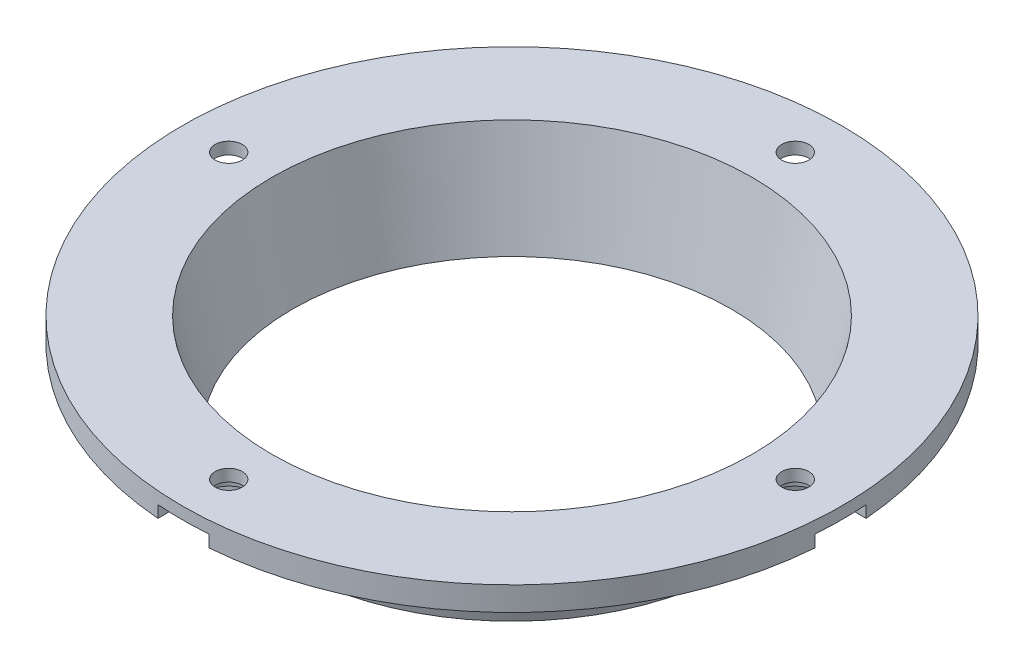
ISO-10303-21;
HEADER;
FILE_DESCRIPTION(('STEP AP214'),'2;1');
FILE_NAME('part.step','',(''),(''),'','','');
FILE_SCHEMA(('AUTOMOTIVE_DESIGN { 1 0 10303 214 1 1 1 1 }'));
ENDSEC;
DATA;
#1=APPLICATION_CONTEXT('core data for automotive mechanical design processes');
#2=APPLICATION_PROTOCOL_DEFINITION('international standard','automotive_design',2000,#1);
#3=PRODUCT_CONTEXT('',#1,'mechanical');
#4=PRODUCT('Part','Part','',(#3));
#5=PRODUCT_RELATED_PRODUCT_CATEGORY('part','',(#4));
#6=PRODUCT_DEFINITION_FORMATION('','',#4);
#7=PRODUCT_DEFINITION_CONTEXT('part definition',#1,'design');
#8=PRODUCT_DEFINITION('design','',#6,#7);
#9=PRODUCT_DEFINITION_SHAPE('','',#8);
#10=(LENGTH_UNIT() NAMED_UNIT(*) SI_UNIT(.MILLI.,.METRE.));
#11=(NAMED_UNIT(*) PLANE_ANGLE_UNIT() SI_UNIT($,.RADIAN.));
#12=(NAMED_UNIT(*) SI_UNIT($,.STERADIAN.) SOLID_ANGLE_UNIT());
#13=UNCERTAINTY_MEASURE_WITH_UNIT(LENGTH_MEASURE(1.E-05),#10,'distance_accuracy_value','');
#14=(GEOMETRIC_REPRESENTATION_CONTEXT(3) GLOBAL_UNCERTAINTY_ASSIGNED_CONTEXT((#13)) GLOBAL_UNIT_ASSIGNED_CONTEXT((#10,
#11,#12)) REPRESENTATION_CONTEXT('',''));
#15=CARTESIAN_POINT('',(0.,0.,0.));
#16=DIRECTION('',(0.,0.,1.));
#17=DIRECTION('',(1.,0.,0.));
#18=AXIS2_PLACEMENT_3D('',#15,#16,#17);
#19=CARTESIAN_POINT('',(3.42382199479561,17.6286066546917,0.));
#20=DIRECTION('',(0.,-1.,0.));
#21=DIRECTION('',(0.,0.,-1.));
#22=AXIS2_PLACEMENT_3D('',#19,#20,#21);
#23=CYLINDRICAL_SURFACE('',#22,41.3);
#24=CARTESIAN_POINT('',(3.42382199479561,30.6286066546917,0.));
#25=DIRECTION('',(0.,-1.,0.));
#26=DIRECTION('',(0.,0.,-1.));
#27=AXIS2_PLACEMENT_3D('',#24,#25,#26);
#28=CIRCLE('',#27,41.3);
#29=CARTESIAN_POINT('',(3.42382199479561,30.6286066546917,-41.3));
#30=VERTEX_POINT('',#29);
#31=EDGE_CURVE('E338',#30,#30,#28,.T.);
#32=ORIENTED_EDGE('',*,*,#31,.T.);
#33=EDGE_LOOP('',(#32));
#34=FACE_BOUND('',#33,.T.);
#35=DIRECTION('',(0.,-1.,0.));
#36=VECTOR('',#35,1.);
#37=CARTESIAN_POINT('',(0.22382199479333,29.1286066546917,41.1758424321833));
#38=LINE('',#37,#36);
#39=CARTESIAN_POINT('',(0.22382199479333,29.1286066546917,41.1758424321833));
#40=VERTEX_POINT('',#39);
#41=CARTESIAN_POINT('',(0.22382199479333,27.6286066546917,41.1758424321833));
#42=VERTEX_POINT('',#41);
#43=EDGE_CURVE('E199',#40,#42,#38,.T.);
#44=ORIENTED_EDGE('',*,*,#43,.F.);
#45=CARTESIAN_POINT('',(3.42382199479561,29.1286066546917,0.));
#46=DIRECTION('',(0.,-1.,0.));
#47=DIRECTION('',(0.,0.,-1.));
#48=AXIS2_PLACEMENT_3D('',#45,#46,#47);
#49=CIRCLE('',#48,41.3);
#50=CARTESIAN_POINT('',(6.62382199479332,29.1286066546917,41.1758424321836));
#51=VERTEX_POINT('',#50);
#52=EDGE_CURVE('E167',#51,#40,#49,.T.);
#53=ORIENTED_EDGE('',*,*,#52,.F.);
#54=DIRECTION('',(0.,-1.,0.));
#55=VECTOR('',#54,1.);
#56=CARTESIAN_POINT('',(6.62382199479332,29.1286066546917,41.1758424321836));
#57=LINE('',#56,#55);
#58=CARTESIAN_POINT('',(6.62382199479332,27.6286066546917,41.1758424321836));
#59=VERTEX_POINT('',#58);
#60=EDGE_CURVE('E203',#51,#59,#57,.T.);
#61=ORIENTED_EDGE('',*,*,#60,.T.);
#62=CARTESIAN_POINT('',(3.42382199479561,27.6286066546917,0.));
#63=DIRECTION('',(0.,-1.,0.));
#64=DIRECTION('',(0.,0.,-1.));
#65=AXIS2_PLACEMENT_3D('',#62,#63,#64);
#66=CIRCLE('',#65,41.3);
#67=CARTESIAN_POINT('',(44.5996644269789,27.6286066546917,3.20000000000215));
#68=VERTEX_POINT('',#67);
#69=EDGE_CURVE('E339',#68,#59,#66,.T.);
#70=ORIENTED_EDGE('',*,*,#69,.F.);
#71=DIRECTION('',(0.,-1.,0.));
#72=VECTOR('',#71,1.);
#73=CARTESIAN_POINT('',(44.5996644269789,29.1286066546917,3.20000000000215));
#74=LINE('',#73,#72);
#75=CARTESIAN_POINT('',(44.5996644269789,29.1286066546917,3.20000000000215));
#76=VERTEX_POINT('',#75);
#77=EDGE_CURVE('E193',#76,#68,#74,.T.);
#78=ORIENTED_EDGE('',*,*,#77,.F.);
#79=CARTESIAN_POINT('',(3.42382199479561,29.1286066546917,0.));
#80=DIRECTION('',(0.,-1.,0.));
#81=DIRECTION('',(0.,0.,-1.));
#82=AXIS2_PLACEMENT_3D('',#79,#80,#81);
#83=CIRCLE('',#82,41.3);
#84=CARTESIAN_POINT('',(44.5996644269792,29.1286066546917,-3.19999999999785));
#85=VERTEX_POINT('',#84);
#86=EDGE_CURVE('E220',#85,#76,#83,.T.);
#87=ORIENTED_EDGE('',*,*,#86,.F.);
#88=DIRECTION('',(0.,-1.,0.));
#89=VECTOR('',#88,1.);
#90=CARTESIAN_POINT('',(44.5996644269792,29.1286066546917,-3.19999999999785));
#91=LINE('',#90,#89);
#92=CARTESIAN_POINT('',(44.5996644269792,27.6286066546917,-3.19999999999785));
#93=VERTEX_POINT('',#92);
#94=EDGE_CURVE('E237',#85,#93,#91,.T.);
#95=ORIENTED_EDGE('',*,*,#94,.T.);
#96=CARTESIAN_POINT('',(6.62382199479762,27.6286066546917,-41.1758424321833));
#97=VERTEX_POINT('',#96);
#98=EDGE_CURVE('E334',#97,#93,#66,.T.);
#99=ORIENTED_EDGE('',*,*,#98,.F.);
#100=DIRECTION('',(0.,-1.,0.));
#101=VECTOR('',#100,1.);
#102=CARTESIAN_POINT('',(6.62382199479762,29.1286066546917,-41.1758424321833));
#103=LINE('',#102,#101);
#104=CARTESIAN_POINT('',(6.62382199479762,29.1286066546917,-41.1758424321833));
#105=VERTEX_POINT('',#104);
#106=EDGE_CURVE('E267',#105,#97,#103,.T.);
#107=ORIENTED_EDGE('',*,*,#106,.F.);
#108=CARTESIAN_POINT('',(3.42382199479561,29.1286066546917,0.));
#109=DIRECTION('',(0.,-1.,0.));
#110=DIRECTION('',(0.,0.,-1.));
#111=AXIS2_PLACEMENT_3D('',#108,#109,#110);
#112=CIRCLE('',#111,41.3);
#113=CARTESIAN_POINT('',(0.223821994797618,29.1286066546917,-41.1758424321836));
#114=VERTEX_POINT('',#113);
#115=EDGE_CURVE('E297',#114,#105,#112,.T.);
#116=ORIENTED_EDGE('',*,*,#115,.F.);
#117=DIRECTION('',(0.,-1.,0.));
#118=VECTOR('',#117,1.);
#119=CARTESIAN_POINT('',(0.223821994797618,29.1286066546917,-41.1758424321836));
#120=LINE('',#119,#118);
#121=CARTESIAN_POINT('',(0.223821994797618,27.6286066546917,-41.1758424321836));
#122=VERTEX_POINT('',#121);
#123=EDGE_CURVE('E316',#114,#122,#120,.T.);
#124=ORIENTED_EDGE('',*,*,#123,.T.);
#125=CARTESIAN_POINT('',(-37.7520204373876,27.6286066546917,-3.20000000000243));
#126=VERTEX_POINT('',#125);
#127=EDGE_CURVE('E333',#126,#122,#66,.T.);
#128=ORIENTED_EDGE('',*,*,#127,.F.);
#129=DIRECTION('',(0.,-1.,0.));
#130=VECTOR('',#129,1.);
#131=CARTESIAN_POINT('',(-37.7520204373876,29.1286066546917,-3.20000000000243));
#132=LINE('',#131,#130);
#133=CARTESIAN_POINT('',(-37.7520204373876,29.1286066546917,-3.20000000000243));
#134=VERTEX_POINT('',#133);
#135=EDGE_CURVE('E228',#134,#126,#132,.T.);
#136=ORIENTED_EDGE('',*,*,#135,.F.);
#137=CARTESIAN_POINT('',(3.42382199479561,29.1286066546917,0.));
#138=DIRECTION('',(0.,-1.,0.));
#139=DIRECTION('',(0.,0.,-1.));
#140=AXIS2_PLACEMENT_3D('',#137,#138,#139);
#141=CIRCLE('',#140,41.3);
#142=CARTESIAN_POINT('',(-37.752020437388,29.1286066546917,3.19999999999756));
#143=VERTEX_POINT('',#142);
#144=EDGE_CURVE('E257',#143,#134,#141,.T.);
#145=ORIENTED_EDGE('',*,*,#144,.F.);
#146=DIRECTION('',(0.,-1.,0.));
#147=VECTOR('',#146,1.);
#148=CARTESIAN_POINT('',(-37.752020437388,29.1286066546917,3.19999999999756));
#149=LINE('',#148,#147);
#150=CARTESIAN_POINT('',(-37.752020437388,27.6286066546917,3.19999999999756));
#151=VERTEX_POINT('',#150);
#152=EDGE_CURVE('E276',#143,#151,#149,.T.);
#153=ORIENTED_EDGE('',*,*,#152,.T.);
#154=EDGE_CURVE('E499',#42,#151,#66,.T.);
#155=ORIENTED_EDGE('',*,*,#154,.F.);
#156=EDGE_LOOP('',(#44,#53,#61,#70,#78,#87,#95,#99,#107,#116,#124,#128,#136,#145,#153,#155));
#157=FACE_BOUND('',#156,.T.);
#158=ADVANCED_FACE('F45',(#34,#157),#23,.T.);
#159=CARTESIAN_POINT('',(0.,27.6286066546917,0.));
#160=DIRECTION('',(0.,1.,0.));
#161=DIRECTION('',(0.,0.,1.));
#162=AXIS2_PLACEMENT_3D('',#159,#160,#161);
#163=PLANE('',#162);
#164=CARTESIAN_POINT('',(3.42382199479561,27.6286066546917,0.));
#165=DIRECTION('',(0.,-1.,0.));
#166=DIRECTION('',(0.,0.,-1.));
#167=AXIS2_PLACEMENT_3D('',#164,#165,#166);
#168=CIRCLE('',#167,30.5);
#169=CARTESIAN_POINT('',(3.42382199479561,27.6286066546917,-30.5));
#170=VERTEX_POINT('',#169);
#171=EDGE_CURVE('E329',#170,#170,#168,.T.);
#172=ORIENTED_EDGE('',*,*,#171,.F.);
#173=EDGE_LOOP('',(#172));
#174=FACE_BOUND('',#173,.T.);
#175=DIRECTION('',(0.,0.,1.));
#176=VECTOR('',#175,1.);
#177=CARTESIAN_POINT('',(0.223821994793632,27.6286066546917,0.));
#178=LINE('',#177,#176);
#179=CARTESIAN_POINT('',(0.223821994793358,27.6286066546917,35.5));
#180=VERTEX_POINT('',#179);
#181=EDGE_CURVE('E61',#180,#42,#178,.T.);
#182=ORIENTED_EDGE('',*,*,#181,.T.);
#183=ORIENTED_EDGE('',*,*,#154,.T.);
#184=DIRECTION('',(1.,0.,0.));
#185=VECTOR('',#184,1.);
#186=CARTESIAN_POINT('',(0.,27.6286066546917,3.19999999999795));
#187=LINE('',#186,#185);
#188=CARTESIAN_POINT('',(-32.0761780052044,27.6286066546917,3.19999999999762));
#189=VERTEX_POINT('',#188);
#190=EDGE_CURVE('E250',#151,#189,#187,.T.);
#191=ORIENTED_EDGE('',*,*,#190,.T.);
#192=CARTESIAN_POINT('',(-32.0761780052044,27.6286066546917,-2.38351005599213E-12));
#193=DIRECTION('',(0.,-1.,0.));
#194=DIRECTION('',(0.,0.,-1.));
#195=AXIS2_PLACEMENT_3D('',#192,#193,#194);
#196=CIRCLE('',#195,3.19999999999999);
#197=CARTESIAN_POINT('',(-32.0761780052044,27.6286066546917,-3.20000000000238));
#198=VERTEX_POINT('',#197);
#199=EDGE_CURVE('E266',#198,#189,#196,.T.);
#200=ORIENTED_EDGE('',*,*,#199,.F.);
#201=DIRECTION('',(-1.,0.,0.));
#202=VECTOR('',#201,1.);
#203=CARTESIAN_POINT('',(0.,27.6286066546917,-3.20000000000202));
#204=LINE('',#203,#202);
#205=EDGE_CURVE('E262',#198,#126,#204,.T.);
#206=ORIENTED_EDGE('',*,*,#205,.T.);
#207=ORIENTED_EDGE('',*,*,#127,.T.);
#208=DIRECTION('',(0.,0.,1.));
#209=VECTOR('',#208,1.);
#210=CARTESIAN_POINT('',(0.223821994797618,27.6286066546917,0.));
#211=LINE('',#210,#209);
#212=CARTESIAN_POINT('',(0.223821994797618,27.6286066546917,-35.5));
#213=VERTEX_POINT('',#212);
#214=EDGE_CURVE('E290',#122,#213,#211,.T.);
#215=ORIENTED_EDGE('',*,*,#214,.T.);
#216=CARTESIAN_POINT('',(3.42382199479763,27.6286066546917,-35.5));
#217=DIRECTION('',(0.,-1.,0.));
#218=DIRECTION('',(0.,0.,-1.));
#219=AXIS2_PLACEMENT_3D('',#216,#217,#218);
#220=CIRCLE('',#219,3.2);
#221=CARTESIAN_POINT('',(6.62382199479763,27.6286066546917,-35.5));
#222=VERTEX_POINT('',#221);
#223=EDGE_CURVE('E306',#222,#213,#220,.T.);
#224=ORIENTED_EDGE('',*,*,#223,.F.);
#225=DIRECTION('',(0.,0.,-1.));
#226=VECTOR('',#225,1.);
#227=CARTESIAN_POINT('',(6.62382199479762,27.6286066546917,0.));
#228=LINE('',#227,#226);
#229=EDGE_CURVE('E302',#222,#97,#228,.T.);
#230=ORIENTED_EDGE('',*,*,#229,.T.);
#231=ORIENTED_EDGE('',*,*,#98,.T.);
#232=DIRECTION('',(-1.,0.,0.));
#233=VECTOR('',#232,1.);
#234=CARTESIAN_POINT('',(0.,27.6286066546917,-3.19999999999801));
#235=LINE('',#234,#233);
#236=CARTESIAN_POINT('',(38.9238219947956,27.6286066546917,-3.19999999999787));
#237=VERTEX_POINT('',#236);
#238=EDGE_CURVE('E213',#93,#237,#235,.T.);
#239=ORIENTED_EDGE('',*,*,#238,.T.);
#240=CARTESIAN_POINT('',(38.9238219947956,27.6286066546917,2.13717932240343E-12));
#241=DIRECTION('',(0.,-1.,0.));
#242=DIRECTION('',(0.,0.,-1.));
#243=AXIS2_PLACEMENT_3D('',#240,#241,#242);
#244=CIRCLE('',#243,3.2);
#245=CARTESIAN_POINT('',(38.9238219947956,27.6286066546917,3.20000000000213));
#246=VERTEX_POINT('',#245);
#247=EDGE_CURVE('E227',#246,#237,#244,.T.);
#248=ORIENTED_EDGE('',*,*,#247,.F.);
#249=DIRECTION('',(1.,0.,0.));
#250=VECTOR('',#249,1.);
#251=CARTESIAN_POINT('',(0.,27.6286066546917,3.20000000000198));
#252=LINE('',#251,#250);
#253=EDGE_CURVE('E69',#246,#68,#252,.T.);
#254=ORIENTED_EDGE('',*,*,#253,.T.);
#255=ORIENTED_EDGE('',*,*,#69,.T.);
#256=DIRECTION('',(0.,0.,-1.));
#257=VECTOR('',#256,1.);
#258=CARTESIAN_POINT('',(6.62382199479362,27.6286066546917,0.));
#259=LINE('',#258,#257);
#260=CARTESIAN_POINT('',(6.62382199479336,27.6286066546917,35.5));
#261=VERTEX_POINT('',#260);
#262=EDGE_CURVE('E177',#59,#261,#259,.T.);
#263=ORIENTED_EDGE('',*,*,#262,.T.);
#264=CARTESIAN_POINT('',(3.42382199479335,27.6286066546917,35.5));
#265=DIRECTION('',(0.,-1.,0.));
#266=DIRECTION('',(0.,0.,-1.));
#267=AXIS2_PLACEMENT_3D('',#264,#265,#266);
#268=CIRCLE('',#267,3.19999999999999);
#269=EDGE_CURVE('E192',#180,#261,#268,.T.);
#270=ORIENTED_EDGE('',*,*,#269,.F.);
#271=EDGE_LOOP('',(#182,#183,#191,#200,#206,#207,#215,#224,#230,#231,#239,#248,#254,#255,#263,#270));
#272=FACE_BOUND('',#271,.T.);
#273=ADVANCED_FACE('F359',(#174,#272),#163,.F.);
#274=CARTESIAN_POINT('',(0.,17.6286066546917,0.));
#275=DIRECTION('',(0.,-1.,0.));
#276=DIRECTION('',(0.,0.,-1.));
#277=AXIS2_PLACEMENT_3D('',#274,#275,#276);
#278=PLANE('',#277);
#279=CARTESIAN_POINT('',(3.42382199479561,17.6286066546917,0.));
#280=DIRECTION('',(0.,-1.,0.));
#281=DIRECTION('',(0.,0.,-1.));
#282=AXIS2_PLACEMENT_3D('',#279,#280,#281);
#283=CIRCLE('',#282,28.5);
#284=CARTESIAN_POINT('',(3.42382199479561,17.6286066546917,-28.5));
#285=VERTEX_POINT('',#284);
#286=EDGE_CURVE('E202',#285,#285,#283,.T.);
#287=ORIENTED_EDGE('',*,*,#286,.T.);
#288=EDGE_LOOP('',(#287));
#289=FACE_BOUND('',#288,.T.);
#290=CARTESIAN_POINT('',(3.42382199479561,17.6286066546917,0.));
#291=DIRECTION('',(0.,-1.,0.));
#292=DIRECTION('',(0.,0.,-1.));
#293=AXIS2_PLACEMENT_3D('',#290,#291,#292);
#294=CIRCLE('',#293,27.4802120312904);
#295=CARTESIAN_POINT('',(3.42382199479561,17.6286066546917,-27.4802120312904));
#296=VERTEX_POINT('',#295);
#297=EDGE_CURVE('E11',#296,#296,#294,.T.);
#298=ORIENTED_EDGE('',*,*,#297,.F.);
#299=EDGE_LOOP('',(#298));
#300=FACE_BOUND('',#299,.T.);
#301=ADVANCED_FACE('F47',(#289,#300),#278,.T.);
#302=CARTESIAN_POINT('',(3.42382199479561,30.6286066546917,0.));
#303=DIRECTION('',(0.,1.,0.));
#304=DIRECTION('',(0.,0.,1.));
#305=AXIS2_PLACEMENT_3D('',#302,#303,#304);
#306=CONICAL_SURFACE('',#305,30.0802120312904,0.197395559849884);
#307=ORIENTED_EDGE('',*,*,#297,.T.);
#308=EDGE_LOOP('',(#307));
#309=FACE_BOUND('',#308,.T.);
#310=CARTESIAN_POINT('',(3.42382199479561,30.6286066546917,0.));
#311=DIRECTION('',(0.,-1.,0.));
#312=DIRECTION('',(0.,0.,-1.));
#313=AXIS2_PLACEMENT_3D('',#310,#311,#312);
#314=CIRCLE('',#313,30.0802120312904);
#315=CARTESIAN_POINT('',(3.42382199479561,30.6286066546917,-30.0802120312904));
#316=VERTEX_POINT('',#315);
#317=EDGE_CURVE('E54',#316,#316,#314,.T.);
#318=ORIENTED_EDGE('',*,*,#317,.F.);
#319=EDGE_LOOP('',(#318));
#320=FACE_BOUND('',#319,.T.);
#321=ADVANCED_FACE('F349',(#309,#320),#306,.F.);
#322=CARTESIAN_POINT('',(0.,30.6286066546917,0.));
#323=DIRECTION('',(0.,1.,0.));
#324=DIRECTION('',(0.,0.,1.));
#325=AXIS2_PLACEMENT_3D('',#322,#323,#324);
#326=PLANE('',#325);
#327=CARTESIAN_POINT('',(3.42382199479763,30.6286066546917,35.5));
#328=DIRECTION('',(0.,-1.,0.));
#329=DIRECTION('',(0.,0.,-1.));
#330=AXIS2_PLACEMENT_3D('',#327,#328,#329);
#331=CIRCLE('',#330,1.7);
#332=CARTESIAN_POINT('',(3.42382199479763,30.6286066546917,33.8));
#333=VERTEX_POINT('',#332);
#334=EDGE_CURVE('E455',#333,#333,#331,.T.);
#335=ORIENTED_EDGE('',*,*,#334,.T.);
#336=EDGE_LOOP('',(#335));
#337=FACE_BOUND('',#336,.T.);
#338=CARTESIAN_POINT('',(3.42382199479561,30.6286066546917,-35.5));
#339=DIRECTION('',(0.,-1.,0.));
#340=DIRECTION('',(0.,0.,-1.));
#341=AXIS2_PLACEMENT_3D('',#338,#339,#340);
#342=CIRCLE('',#341,1.7);
#343=CARTESIAN_POINT('',(3.42382199479561,30.6286066546917,-37.2));
#344=VERTEX_POINT('',#343);
#345=EDGE_CURVE('E457',#344,#344,#342,.T.);
#346=ORIENTED_EDGE('',*,*,#345,.T.);
#347=EDGE_LOOP('',(#346));
#348=FACE_BOUND('',#347,.T.);
#349=CARTESIAN_POINT('',(-32.0761780052034,30.6286066546917,1.00613961606655E-12));
#350=DIRECTION('',(0.,-1.,0.));
#351=DIRECTION('',(0.,0.,-1.));
#352=AXIS2_PLACEMENT_3D('',#349,#350,#351);
#353=CIRCLE('',#352,1.7);
#354=CARTESIAN_POINT('',(-32.0761780052034,30.6286066546917,-1.69999999999899));
#355=VERTEX_POINT('',#354);
#356=EDGE_CURVE('E464',#355,#355,#353,.T.);
#357=ORIENTED_EDGE('',*,*,#356,.T.);
#358=EDGE_LOOP('',(#357));
#359=FACE_BOUND('',#358,.T.);
#360=CARTESIAN_POINT('',(38.9238219947966,30.6286066546917,-1.00267016911459E-12));
#361=DIRECTION('',(0.,-1.,0.));
#362=DIRECTION('',(0.,0.,-1.));
#363=AXIS2_PLACEMENT_3D('',#360,#361,#362);
#364=CIRCLE('',#363,1.69999999999996);
#365=CARTESIAN_POINT('',(38.9238219947966,30.6286066546917,-1.70000000000096));
#366=VERTEX_POINT('',#365);
#367=EDGE_CURVE('E470',#366,#366,#364,.T.);
#368=ORIENTED_EDGE('',*,*,#367,.T.);
#369=EDGE_LOOP('',(#368));
#370=FACE_BOUND('',#369,.T.);
#371=ORIENTED_EDGE('',*,*,#317,.T.);
#372=EDGE_LOOP('',(#371));
#373=FACE_BOUND('',#372,.T.);
#374=ORIENTED_EDGE('',*,*,#31,.F.);
#375=EDGE_LOOP('',(#374));
#376=FACE_BOUND('',#375,.T.);
#377=ADVANCED_FACE('F346',(#337,#348,#359,#370,#373,#376),#326,.T.);
#378=CARTESIAN_POINT('',(3.42382199479561,17.6286066546917,0.));
#379=DIRECTION('',(0.,1.,0.));
#380=DIRECTION('',(0.,0.,1.));
#381=AXIS2_PLACEMENT_3D('',#378,#379,#380);
#382=CONICAL_SURFACE('',#381,28.5,0.197395559849884);
#383=ORIENTED_EDGE('',*,*,#171,.T.);
#384=EDGE_LOOP('',(#383));
#385=FACE_BOUND('',#384,.T.);
#386=ORIENTED_EDGE('',*,*,#286,.F.);
#387=EDGE_LOOP('',(#386));
#388=FACE_BOUND('',#387,.T.);
#389=ADVANCED_FACE('F356',(#385,#388),#382,.T.);
#390=CARTESIAN_POINT('',(6.62382199479762,29.1286066546917,0.));
#391=DIRECTION('',(-1.,0.,0.));
#392=DIRECTION('',(0.,0.,1.));
#393=AXIS2_PLACEMENT_3D('',#390,#391,#392);
#394=PLANE('',#393);
#395=ORIENTED_EDGE('',*,*,#229,.F.);
#396=DIRECTION('',(0.,-1.,0.));
#397=VECTOR('',#396,1.);
#398=CARTESIAN_POINT('',(6.62382199479762,29.1286066546917,-35.5));
#399=LINE('',#398,#397);
#400=CARTESIAN_POINT('',(6.62382199479762,29.1286066546917,-35.5));
#401=VERTEX_POINT('',#400);
#402=EDGE_CURVE('E301',#401,#222,#399,.T.);
#403=ORIENTED_EDGE('',*,*,#402,.F.);
#404=DIRECTION('',(0.,0.,-1.));
#405=VECTOR('',#404,1.);
#406=CARTESIAN_POINT('',(6.62382199479762,29.1286066546917,0.));
#407=LINE('',#406,#405);
#408=EDGE_CURVE('E286',#401,#105,#407,.T.);
#409=ORIENTED_EDGE('',*,*,#408,.T.);
#410=ORIENTED_EDGE('',*,*,#106,.T.);
#411=EDGE_LOOP('',(#395,#403,#409,#410));
#412=FACE_BOUND('',#411,.T.);
#413=ADVANCED_FACE('F373',(#412),#394,.T.);
#414=CARTESIAN_POINT('',(0.223821994797618,29.1286066546917,0.));
#415=DIRECTION('',(1.,0.,0.));
#416=DIRECTION('',(0.,0.,-1.));
#417=AXIS2_PLACEMENT_3D('',#414,#415,#416);
#418=PLANE('',#417);
#419=ORIENTED_EDGE('',*,*,#214,.F.);
#420=ORIENTED_EDGE('',*,*,#123,.F.);
#421=DIRECTION('',(0.,0.,1.));
#422=VECTOR('',#421,1.);
#423=CARTESIAN_POINT('',(0.223821994797618,29.1286066546917,0.));
#424=LINE('',#423,#422);
#425=CARTESIAN_POINT('',(0.223821994797618,29.1286066546917,-35.5));
#426=VERTEX_POINT('',#425);
#427=EDGE_CURVE('E294',#114,#426,#424,.T.);
#428=ORIENTED_EDGE('',*,*,#427,.T.);
#429=DIRECTION('',(0.,-1.,0.));
#430=VECTOR('',#429,1.);
#431=CARTESIAN_POINT('',(0.223821994797618,29.1286066546917,-35.5));
#432=LINE('',#431,#430);
#433=EDGE_CURVE('E320',#426,#213,#432,.T.);
#434=ORIENTED_EDGE('',*,*,#433,.T.);
#435=EDGE_LOOP('',(#419,#420,#428,#434));
#436=FACE_BOUND('',#435,.T.);
#437=ADVANCED_FACE('F377',(#436),#418,.T.);
#438=CARTESIAN_POINT('',(3.42382199479763,29.1286066546917,-35.5));
#439=DIRECTION('',(0.,-1.,0.));
#440=DIRECTION('',(0.,0.,-1.));
#441=AXIS2_PLACEMENT_3D('',#438,#439,#440);
#442=CYLINDRICAL_SURFACE('',#441,3.2);
#443=ORIENTED_EDGE('',*,*,#223,.T.);
#444=ORIENTED_EDGE('',*,*,#433,.F.);
#445=CARTESIAN_POINT('',(3.42382199479763,29.1286066546917,-35.5));
#446=DIRECTION('',(0.,-1.,0.));
#447=DIRECTION('',(0.,0.,-1.));
#448=AXIS2_PLACEMENT_3D('',#445,#446,#447);
#449=CIRCLE('',#448,3.2);
#450=EDGE_CURVE('E289',#401,#426,#449,.T.);
#451=ORIENTED_EDGE('',*,*,#450,.F.);
#452=ORIENTED_EDGE('',*,*,#402,.T.);
#453=EDGE_LOOP('',(#443,#444,#451,#452));
#454=FACE_BOUND('',#453,.T.);
#455=ADVANCED_FACE('F379',(#454),#442,.F.);
#456=CARTESIAN_POINT('',(0.,29.1286066546917,0.));
#457=DIRECTION('',(0.,-1.,0.));
#458=DIRECTION('',(0.,0.,-1.));
#459=AXIS2_PLACEMENT_3D('',#456,#457,#458);
#460=PLANE('',#459);
#461=CARTESIAN_POINT('',(3.42382199479561,29.1286066546917,-35.5));
#462=DIRECTION('',(0.,-1.,0.));
#463=DIRECTION('',(0.,0.,-1.));
#464=AXIS2_PLACEMENT_3D('',#461,#462,#463);
#465=CIRCLE('',#464,1.7);
#466=CARTESIAN_POINT('',(3.42382199479561,29.1286066546917,-37.2));
#467=VERTEX_POINT('',#466);
#468=EDGE_CURVE('E307',#467,#467,#465,.T.);
#469=ORIENTED_EDGE('',*,*,#468,.F.);
#470=EDGE_LOOP('',(#469));
#471=FACE_BOUND('',#470,.T.);
#472=ORIENTED_EDGE('',*,*,#408,.F.);
#473=ORIENTED_EDGE('',*,*,#450,.T.);
#474=ORIENTED_EDGE('',*,*,#427,.F.);
#475=ORIENTED_EDGE('',*,*,#115,.T.);
#476=EDGE_LOOP('',(#472,#473,#474,#475));
#477=FACE_BOUND('',#476,.T.);
#478=ADVANCED_FACE('F382',(#471,#477),#460,.T.);
#479=CARTESIAN_POINT('',(0.,29.1286066546917,-3.20000000000202));
#480=DIRECTION('',(0.,0.,1.));
#481=DIRECTION('',(1.,0.,0.));
#482=AXIS2_PLACEMENT_3D('',#479,#480,#481);
#483=PLANE('',#482);
#484=ORIENTED_EDGE('',*,*,#205,.F.);
#485=DIRECTION('',(0.,-1.,0.));
#486=VECTOR('',#485,1.);
#487=CARTESIAN_POINT('',(-32.0761780052044,29.1286066546917,-3.20000000000237));
#488=LINE('',#487,#486);
#489=CARTESIAN_POINT('',(-32.0761780052044,29.1286066546917,-3.20000000000237));
#490=VERTEX_POINT('',#489);
#491=EDGE_CURVE('E261',#490,#198,#488,.T.);
#492=ORIENTED_EDGE('',*,*,#491,.F.);
#493=DIRECTION('',(-1.,0.,0.));
#494=VECTOR('',#493,1.);
#495=CARTESIAN_POINT('',(0.,29.1286066546917,-3.20000000000202));
#496=LINE('',#495,#494);
#497=EDGE_CURVE('E246',#490,#134,#496,.T.);
#498=ORIENTED_EDGE('',*,*,#497,.T.);
#499=ORIENTED_EDGE('',*,*,#135,.T.);
#500=EDGE_LOOP('',(#484,#492,#498,#499));
#501=FACE_BOUND('',#500,.T.);
#502=ADVANCED_FACE('F389',(#501),#483,.T.);
#503=CARTESIAN_POINT('',(0.,29.1286066546917,3.19999999999795));
#504=DIRECTION('',(0.,0.,-1.));
#505=DIRECTION('',(-1.,0.,0.));
#506=AXIS2_PLACEMENT_3D('',#503,#504,#505);
#507=PLANE('',#506);
#508=ORIENTED_EDGE('',*,*,#190,.F.);
#509=ORIENTED_EDGE('',*,*,#152,.F.);
#510=DIRECTION('',(1.,0.,0.));
#511=VECTOR('',#510,1.);
#512=CARTESIAN_POINT('',(0.,29.1286066546917,3.19999999999795));
#513=LINE('',#512,#511);
#514=CARTESIAN_POINT('',(-32.0761780052044,29.1286066546917,3.19999999999762));
#515=VERTEX_POINT('',#514);
#516=EDGE_CURVE('E254',#143,#515,#513,.T.);
#517=ORIENTED_EDGE('',*,*,#516,.T.);
#518=DIRECTION('',(0.,-1.,0.));
#519=VECTOR('',#518,1.);
#520=CARTESIAN_POINT('',(-32.0761780052044,29.1286066546917,3.19999999999762));
#521=LINE('',#520,#519);
#522=EDGE_CURVE('E280',#515,#189,#521,.T.);
#523=ORIENTED_EDGE('',*,*,#522,.T.);
#524=EDGE_LOOP('',(#508,#509,#517,#523));
#525=FACE_BOUND('',#524,.T.);
#526=ADVANCED_FACE('F393',(#525),#507,.T.);
#527=CARTESIAN_POINT('',(-32.0761780052044,29.1286066546917,-2.38351005599213E-12));
#528=DIRECTION('',(0.,-1.,0.));
#529=DIRECTION('',(0.,0.,-1.));
#530=AXIS2_PLACEMENT_3D('',#527,#528,#529);
#531=CYLINDRICAL_SURFACE('',#530,3.19999999999999);
#532=ORIENTED_EDGE('',*,*,#199,.T.);
#533=ORIENTED_EDGE('',*,*,#522,.F.);
#534=CARTESIAN_POINT('',(-32.0761780052044,29.1286066546917,-2.38351005599213E-12));
#535=DIRECTION('',(0.,-1.,0.));
#536=DIRECTION('',(0.,0.,-1.));
#537=AXIS2_PLACEMENT_3D('',#534,#535,#536);
#538=CIRCLE('',#537,3.19999999999999);
#539=EDGE_CURVE('E249',#490,#515,#538,.T.);
#540=ORIENTED_EDGE('',*,*,#539,.F.);
#541=ORIENTED_EDGE('',*,*,#491,.T.);
#542=EDGE_LOOP('',(#532,#533,#540,#541));
#543=FACE_BOUND('',#542,.T.);
#544=ADVANCED_FACE('F395',(#543),#531,.F.);
#545=CARTESIAN_POINT('',(0.,29.1286066546917,0.));
#546=DIRECTION('',(0.,-1.,0.));
#547=DIRECTION('',(0.,0.,-1.));
#548=AXIS2_PLACEMENT_3D('',#545,#546,#547);
#549=PLANE('',#548);
#550=CARTESIAN_POINT('',(-32.0761780052034,29.1286066546917,1.00613961606655E-12));
#551=DIRECTION('',(0.,-1.,0.));
#552=DIRECTION('',(0.,0.,-1.));
#553=AXIS2_PLACEMENT_3D('',#550,#551,#552);
#554=CIRCLE('',#553,1.7);
#555=CARTESIAN_POINT('',(-32.0761780052034,29.1286066546917,-1.69999999999899));
#556=VERTEX_POINT('',#555);
#557=EDGE_CURVE('E477',#556,#556,#554,.T.);
#558=ORIENTED_EDGE('',*,*,#557,.F.);
#559=EDGE_LOOP('',(#558));
#560=FACE_BOUND('',#559,.T.);
#561=ORIENTED_EDGE('',*,*,#497,.F.);
#562=ORIENTED_EDGE('',*,*,#539,.T.);
#563=ORIENTED_EDGE('',*,*,#516,.F.);
#564=ORIENTED_EDGE('',*,*,#144,.T.);
#565=EDGE_LOOP('',(#561,#562,#563,#564));
#566=FACE_BOUND('',#565,.T.);
#567=ADVANCED_FACE('F398',(#560,#566),#549,.T.);
#568=CARTESIAN_POINT('',(0.,29.1286066546917,3.20000000000198));
#569=DIRECTION('',(0.,0.,-1.));
#570=DIRECTION('',(-1.,0.,0.));
#571=AXIS2_PLACEMENT_3D('',#568,#569,#570);
#572=PLANE('',#571);
#573=ORIENTED_EDGE('',*,*,#253,.F.);
#574=DIRECTION('',(0.,-1.,0.));
#575=VECTOR('',#574,1.);
#576=CARTESIAN_POINT('',(38.9238219947956,29.1286066546917,3.20000000000212));
#577=LINE('',#576,#575);
#578=CARTESIAN_POINT('',(38.9238219947956,29.1286066546917,3.20000000000212));
#579=VERTEX_POINT('',#578);
#580=EDGE_CURVE('E224',#579,#246,#577,.T.);
#581=ORIENTED_EDGE('',*,*,#580,.F.);
#582=DIRECTION('',(1.,0.,0.));
#583=VECTOR('',#582,1.);
#584=CARTESIAN_POINT('',(0.,29.1286066546917,3.20000000000198));
#585=LINE('',#584,#583);
#586=EDGE_CURVE('E209',#579,#76,#585,.T.);
#587=ORIENTED_EDGE('',*,*,#586,.T.);
#588=ORIENTED_EDGE('',*,*,#77,.T.);
#589=EDGE_LOOP('',(#573,#581,#587,#588));
#590=FACE_BOUND('',#589,.T.);
#591=ADVANCED_FACE('F405',(#590),#572,.T.);
#592=CARTESIAN_POINT('',(0.,29.1286066546917,-3.19999999999801));
#593=DIRECTION('',(0.,0.,1.));
#594=DIRECTION('',(1.,0.,0.));
#595=AXIS2_PLACEMENT_3D('',#592,#593,#594);
#596=PLANE('',#595);
#597=ORIENTED_EDGE('',*,*,#238,.F.);
#598=ORIENTED_EDGE('',*,*,#94,.F.);
#599=DIRECTION('',(-1.,0.,0.));
#600=VECTOR('',#599,1.);
#601=CARTESIAN_POINT('',(0.,29.1286066546917,-3.19999999999801));
#602=LINE('',#601,#600);
#603=CARTESIAN_POINT('',(38.9238219947956,29.1286066546917,-3.19999999999787));
#604=VERTEX_POINT('',#603);
#605=EDGE_CURVE('E217',#85,#604,#602,.T.);
#606=ORIENTED_EDGE('',*,*,#605,.T.);
#607=DIRECTION('',(0.,-1.,0.));
#608=VECTOR('',#607,1.);
#609=CARTESIAN_POINT('',(38.9238219947956,29.1286066546917,-3.19999999999787));
#610=LINE('',#609,#608);
#611=EDGE_CURVE('E241',#604,#237,#610,.T.);
#612=ORIENTED_EDGE('',*,*,#611,.T.);
#613=EDGE_LOOP('',(#597,#598,#606,#612));
#614=FACE_BOUND('',#613,.T.);
#615=ADVANCED_FACE('F409',(#614),#596,.T.);
#616=CARTESIAN_POINT('',(38.9238219947956,29.1286066546917,2.13717932240343E-12));
#617=DIRECTION('',(0.,-1.,0.));
#618=DIRECTION('',(0.,0.,-1.));
#619=AXIS2_PLACEMENT_3D('',#616,#617,#618);
#620=CYLINDRICAL_SURFACE('',#619,3.2);
#621=ORIENTED_EDGE('',*,*,#247,.T.);
#622=ORIENTED_EDGE('',*,*,#611,.F.);
#623=CARTESIAN_POINT('',(38.9238219947956,29.1286066546917,2.13717932240343E-12));
#624=DIRECTION('',(0.,-1.,0.));
#625=DIRECTION('',(0.,0.,-1.));
#626=AXIS2_PLACEMENT_3D('',#623,#624,#625);
#627=CIRCLE('',#626,3.2);
#628=EDGE_CURVE('E212',#579,#604,#627,.T.);
#629=ORIENTED_EDGE('',*,*,#628,.F.);
#630=ORIENTED_EDGE('',*,*,#580,.T.);
#631=EDGE_LOOP('',(#621,#622,#629,#630));
#632=FACE_BOUND('',#631,.T.);
#633=ADVANCED_FACE('F410',(#632),#620,.F.);
#634=CARTESIAN_POINT('',(0.,29.1286066546917,0.));
#635=DIRECTION('',(0.,-1.,0.));
#636=DIRECTION('',(0.,0.,-1.));
#637=AXIS2_PLACEMENT_3D('',#634,#635,#636);
#638=PLANE('',#637);
#639=CARTESIAN_POINT('',(38.9238219947966,29.1286066546917,-1.00267016911459E-12));
#640=DIRECTION('',(0.,-1.,0.));
#641=DIRECTION('',(0.,0.,-1.));
#642=AXIS2_PLACEMENT_3D('',#639,#640,#641);
#643=CIRCLE('',#642,1.69999999999996);
#644=CARTESIAN_POINT('',(38.9238219947966,29.1286066546917,-1.70000000000096));
#645=VERTEX_POINT('',#644);
#646=EDGE_CURVE('E461',#645,#645,#643,.T.);
#647=ORIENTED_EDGE('',*,*,#646,.F.);
#648=EDGE_LOOP('',(#647));
#649=FACE_BOUND('',#648,.T.);
#650=ORIENTED_EDGE('',*,*,#586,.F.);
#651=ORIENTED_EDGE('',*,*,#628,.T.);
#652=ORIENTED_EDGE('',*,*,#605,.F.);
#653=ORIENTED_EDGE('',*,*,#86,.T.);
#654=EDGE_LOOP('',(#650,#651,#652,#653));
#655=FACE_BOUND('',#654,.T.);
#656=ADVANCED_FACE('F413',(#649,#655),#638,.T.);
#657=CARTESIAN_POINT('',(0.223821994793632,29.1286066546917,0.));
#658=DIRECTION('',(1.,0.,0.));
#659=DIRECTION('',(0.,0.,-1.));
#660=AXIS2_PLACEMENT_3D('',#657,#658,#659);
#661=PLANE('',#660);
#662=ORIENTED_EDGE('',*,*,#181,.F.);
#663=DIRECTION('',(0.,-1.,0.));
#664=VECTOR('',#663,1.);
#665=CARTESIAN_POINT('',(0.223821994793372,29.1286066546917,35.5));
#666=LINE('',#665,#664);
#667=CARTESIAN_POINT('',(0.223821994793372,29.1286066546917,35.5));
#668=VERTEX_POINT('',#667);
#669=EDGE_CURVE('E156',#668,#180,#666,.T.);
#670=ORIENTED_EDGE('',*,*,#669,.F.);
#671=DIRECTION('',(0.,0.,1.));
#672=VECTOR('',#671,1.);
#673=CARTESIAN_POINT('',(0.223821994793632,29.1286066546917,0.));
#674=LINE('',#673,#672);
#675=EDGE_CURVE('E159',#668,#40,#674,.T.);
#676=ORIENTED_EDGE('',*,*,#675,.T.);
#677=ORIENTED_EDGE('',*,*,#43,.T.);
#678=EDGE_LOOP('',(#662,#670,#676,#677));
#679=FACE_BOUND('',#678,.T.);
#680=ADVANCED_FACE('F158',(#679),#661,.T.);
#681=CARTESIAN_POINT('',(6.62382199479362,29.1286066546917,0.));
#682=DIRECTION('',(-1.,0.,0.));
#683=DIRECTION('',(0.,0.,1.));
#684=AXIS2_PLACEMENT_3D('',#681,#682,#683);
#685=PLANE('',#684);
#686=ORIENTED_EDGE('',*,*,#262,.F.);
#687=ORIENTED_EDGE('',*,*,#60,.F.);
#688=DIRECTION('',(0.,0.,-1.));
#689=VECTOR('',#688,1.);
#690=CARTESIAN_POINT('',(6.62382199479362,29.1286066546917,0.));
#691=LINE('',#690,#689);
#692=CARTESIAN_POINT('',(6.62382199479336,29.1286066546917,35.5));
#693=VERTEX_POINT('',#692);
#694=EDGE_CURVE('E182',#51,#693,#691,.T.);
#695=ORIENTED_EDGE('',*,*,#694,.T.);
#696=DIRECTION('',(0.,-1.,0.));
#697=VECTOR('',#696,1.);
#698=CARTESIAN_POINT('',(6.62382199479336,29.1286066546917,35.5));
#699=LINE('',#698,#697);
#700=EDGE_CURVE('E166',#693,#261,#699,.T.);
#701=ORIENTED_EDGE('',*,*,#700,.T.);
#702=EDGE_LOOP('',(#686,#687,#695,#701));
#703=FACE_BOUND('',#702,.T.);
#704=ADVANCED_FACE('F423',(#703),#685,.T.);
#705=CARTESIAN_POINT('',(3.42382199479335,29.1286066546917,35.5));
#706=DIRECTION('',(0.,-1.,0.));
#707=DIRECTION('',(0.,0.,-1.));
#708=AXIS2_PLACEMENT_3D('',#705,#706,#707);
#709=CYLINDRICAL_SURFACE('',#708,3.19999999999999);
#710=ORIENTED_EDGE('',*,*,#269,.T.);
#711=ORIENTED_EDGE('',*,*,#700,.F.);
#712=CARTESIAN_POINT('',(3.42382199479335,29.1286066546917,35.5));
#713=DIRECTION('',(0.,-1.,0.));
#714=DIRECTION('',(0.,0.,-1.));
#715=AXIS2_PLACEMENT_3D('',#712,#713,#714);
#716=CIRCLE('',#715,3.19999999999999);
#717=EDGE_CURVE('E173',#668,#693,#716,.T.);
#718=ORIENTED_EDGE('',*,*,#717,.F.);
#719=ORIENTED_EDGE('',*,*,#669,.T.);
#720=EDGE_LOOP('',(#710,#711,#718,#719));
#721=FACE_BOUND('',#720,.T.);
#722=ADVANCED_FACE('F180',(#721),#709,.F.);
#723=CARTESIAN_POINT('',(0.,29.1286066546917,0.));
#724=DIRECTION('',(0.,-1.,0.));
#725=DIRECTION('',(0.,0.,-1.));
#726=AXIS2_PLACEMENT_3D('',#723,#724,#725);
#727=PLANE('',#726);
#728=CARTESIAN_POINT('',(3.42382199479763,29.1286066546917,35.5));
#729=DIRECTION('',(0.,-1.,0.));
#730=DIRECTION('',(0.,0.,-1.));
#731=AXIS2_PLACEMENT_3D('',#728,#729,#730);
#732=CIRCLE('',#731,1.7);
#733=CARTESIAN_POINT('',(3.42382199479763,29.1286066546917,33.8));
#734=VERTEX_POINT('',#733);
#735=EDGE_CURVE('E452',#734,#734,#732,.T.);
#736=ORIENTED_EDGE('',*,*,#735,.F.);
#737=EDGE_LOOP('',(#736));
#738=FACE_BOUND('',#737,.T.);
#739=ORIENTED_EDGE('',*,*,#675,.F.);
#740=ORIENTED_EDGE('',*,*,#717,.T.);
#741=ORIENTED_EDGE('',*,*,#694,.F.);
#742=ORIENTED_EDGE('',*,*,#52,.T.);
#743=EDGE_LOOP('',(#739,#740,#741,#742));
#744=FACE_BOUND('',#743,.T.);
#745=ADVANCED_FACE('F171',(#738,#744),#727,.T.);
#746=CARTESIAN_POINT('',(3.42382199479763,30.6286066546917,35.5));
#747=DIRECTION('',(0.,-1.,0.));
#748=DIRECTION('',(0.,0.,-1.));
#749=AXIS2_PLACEMENT_3D('',#746,#747,#748);
#750=CYLINDRICAL_SURFACE('',#749,1.7);
#751=ORIENTED_EDGE('',*,*,#735,.T.);
#752=EDGE_LOOP('',(#751));
#753=FACE_BOUND('',#752,.T.);
#754=ORIENTED_EDGE('',*,*,#334,.F.);
#755=EDGE_LOOP('',(#754));
#756=FACE_BOUND('',#755,.T.);
#757=ADVANCED_FACE('F431',(#753,#756),#750,.F.);
#758=CARTESIAN_POINT('',(38.9238219947966,30.6286066546917,-1.00267016911459E-12));
#759=DIRECTION('',(0.,-1.,0.));
#760=DIRECTION('',(0.,0.,-1.));
#761=AXIS2_PLACEMENT_3D('',#758,#759,#760);
#762=CYLINDRICAL_SURFACE('',#761,1.69999999999996);
#763=ORIENTED_EDGE('',*,*,#646,.T.);
#764=EDGE_LOOP('',(#763));
#765=FACE_BOUND('',#764,.T.);
#766=ORIENTED_EDGE('',*,*,#367,.F.);
#767=EDGE_LOOP('',(#766));
#768=FACE_BOUND('',#767,.T.);
#769=ADVANCED_FACE('F433',(#765,#768),#762,.F.);
#770=CARTESIAN_POINT('',(-32.0761780052034,30.6286066546917,1.00613961606655E-12));
#771=DIRECTION('',(0.,-1.,0.));
#772=DIRECTION('',(0.,0.,-1.));
#773=AXIS2_PLACEMENT_3D('',#770,#771,#772);
#774=CYLINDRICAL_SURFACE('',#773,1.7);
#775=ORIENTED_EDGE('',*,*,#557,.T.);
#776=EDGE_LOOP('',(#775));
#777=FACE_BOUND('',#776,.T.);
#778=ORIENTED_EDGE('',*,*,#356,.F.);
#779=EDGE_LOOP('',(#778));
#780=FACE_BOUND('',#779,.T.);
#781=ADVANCED_FACE('F436',(#777,#780),#774,.F.);
#782=CARTESIAN_POINT('',(3.42382199479561,30.6286066546917,-35.5));
#783=DIRECTION('',(0.,-1.,0.));
#784=DIRECTION('',(0.,0.,-1.));
#785=AXIS2_PLACEMENT_3D('',#782,#783,#784);
#786=CYLINDRICAL_SURFACE('',#785,1.7);
#787=ORIENTED_EDGE('',*,*,#468,.T.);
#788=EDGE_LOOP('',(#787));
#789=FACE_BOUND('',#788,.T.);
#790=ORIENTED_EDGE('',*,*,#345,.F.);
#791=EDGE_LOOP('',(#790));
#792=FACE_BOUND('',#791,.T.);
#793=ADVANCED_FACE('F440',(#789,#792),#786,.F.);
#794=CLOSED_SHELL('',(#158,#273,#301,#321,#377,#389,#413,#437,#455,#478,#502,#526,#544,#567,
#591,#615,#633,#656,#680,#704,#722,#745,#757,#769,#781,#793));
#795=MANIFOLD_SOLID_BREP('B2',#794);
#796=ADVANCED_BREP_SHAPE_REPRESENTATION('',(#18,#795),#14);
#797=SHAPE_DEFINITION_REPRESENTATION(#9,#796);
ENDSEC;
END-ISO-10303-21;
